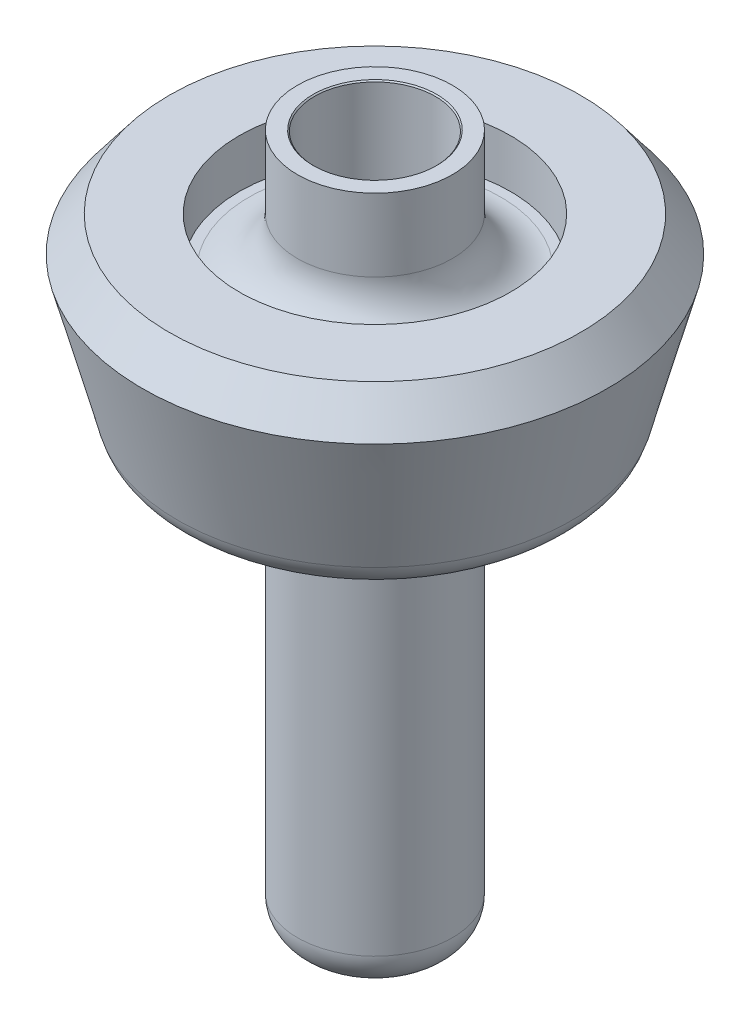
ISO-10303-21;
HEADER;
FILE_DESCRIPTION(('STEP AP214'),'2;1');
FILE_NAME('part.step','',(''),(''),'','','');
FILE_SCHEMA(('AUTOMOTIVE_DESIGN { 1 0 10303 214 1 1 1 1 }'));
ENDSEC;
DATA;
#1=APPLICATION_CONTEXT('core data for automotive mechanical design processes');
#2=APPLICATION_PROTOCOL_DEFINITION('international standard','automotive_design',2000,#1);
#3=PRODUCT_CONTEXT('',#1,'mechanical');
#4=PRODUCT('Part','Part','',(#3));
#5=PRODUCT_RELATED_PRODUCT_CATEGORY('part','',(#4));
#6=PRODUCT_DEFINITION_FORMATION('','',#4);
#7=PRODUCT_DEFINITION_CONTEXT('part definition',#1,'design');
#8=PRODUCT_DEFINITION('design','',#6,#7);
#9=PRODUCT_DEFINITION_SHAPE('','',#8);
#10=(LENGTH_UNIT() NAMED_UNIT(*) SI_UNIT(.MILLI.,.METRE.));
#11=(NAMED_UNIT(*) PLANE_ANGLE_UNIT() SI_UNIT($,.RADIAN.));
#12=(NAMED_UNIT(*) SI_UNIT($,.STERADIAN.) SOLID_ANGLE_UNIT());
#13=UNCERTAINTY_MEASURE_WITH_UNIT(LENGTH_MEASURE(1.E-05),#10,'distance_accuracy_value','');
#14=(GEOMETRIC_REPRESENTATION_CONTEXT(3) GLOBAL_UNCERTAINTY_ASSIGNED_CONTEXT((#13)) GLOBAL_UNIT_ASSIGNED_CONTEXT((#10,
#11,#12)) REPRESENTATION_CONTEXT('',''));
#15=CARTESIAN_POINT('',(0.,0.,0.));
#16=DIRECTION('',(0.,0.,1.));
#17=DIRECTION('',(1.,0.,0.));
#18=AXIS2_PLACEMENT_3D('',#15,#16,#17);
#19=CARTESIAN_POINT('',(1.6,15.,0.));
#20=DIRECTION('',(0.,-1.,0.));
#21=DIRECTION('',(1.,0.,0.));
#22=AXIS2_PLACEMENT_3D('',#19,#20,#21);
#23=PLANE('',#22);
#24=CARTESIAN_POINT('',(0.,15.,0.));
#25=DIRECTION('',(0.,1.,0.));
#26=DIRECTION('',(0.,0.,1.));
#27=AXIS2_PLACEMENT_3D('',#24,#25,#26);
#28=CIRCLE('',#27,1.275);
#29=CARTESIAN_POINT('',(0.,15.,1.275));
#30=VERTEX_POINT('',#29);
#31=EDGE_CURVE('E67',#30,#30,#28,.T.);
#32=ORIENTED_EDGE('',*,*,#31,.F.);
#33=EDGE_LOOP('',(#32));
#34=FACE_BOUND('',#33,.T.);
#35=CARTESIAN_POINT('',(0.,15.,0.));
#36=DIRECTION('',(0.,1.,0.));
#37=DIRECTION('',(-1.,0.,0.));
#38=AXIS2_PLACEMENT_3D('',#35,#36,#37);
#39=CIRCLE('',#38,1.6);
#40=CARTESIAN_POINT('',(-1.6,15.,0.));
#41=VERTEX_POINT('',#40);
#42=EDGE_CURVE('E60',#41,#41,#39,.T.);
#43=ORIENTED_EDGE('',*,*,#42,.T.);
#44=EDGE_LOOP('',(#43));
#45=FACE_BOUND('',#44,.T.);
#46=ADVANCED_FACE('F41',(#34,#45),#23,.F.);
#47=CARTESIAN_POINT('',(0.,0.597128129211026,0.));
#48=DIRECTION('',(0.,1.,0.));
#49=DIRECTION('',(-1.,0.,0.));
#50=AXIS2_PLACEMENT_3D('',#47,#48,#49);
#51=SPHERICAL_SURFACE('',#50,0.517128129211026);
#52=CARTESIAN_POINT('',(0.,0.149282032302755,0.));
#53=DIRECTION('',(0.,1.,0.));
#54=DIRECTION('',(-1.,0.,0.));
#55=AXIS2_PLACEMENT_3D('',#52,#53,#54);
#56=CIRCLE('',#55,0.258564064605514);
#57=CARTESIAN_POINT('',(-0.258564064605514,0.149282032302755,0.));
#58=VERTEX_POINT('',#57);
#59=EDGE_CURVE('E100',#58,#58,#56,.T.);
#60=ORIENTED_EDGE('',*,*,#59,.F.);
#61=EDGE_LOOP('',(#60));
#62=FACE_BOUND('',#61,.T.);
#63=ADVANCED_FACE('F117',(#62),#51,.T.);
#64=CARTESIAN_POINT('',(0.,0.149282032302755,0.));
#65=DIRECTION('',(0.,1.,0.));
#66=DIRECTION('',(-1.,0.,0.));
#67=AXIS2_PLACEMENT_3D('',#64,#65,#66);
#68=CONICAL_SURFACE('',#67,0.258564064605514,1.0471975511966);
#69=CARTESIAN_POINT('',(0.,0.707254079757288,0.));
#70=DIRECTION('',(0.,1.,0.));
#71=DIRECTION('',(-1.,0.,0.));
#72=AXIS2_PLACEMENT_3D('',#69,#70,#71);
#73=CIRCLE('',#72,1.225);
#74=CARTESIAN_POINT('',(-1.225,0.707254079757288,0.));
#75=VERTEX_POINT('',#74);
#76=EDGE_CURVE('E97',#75,#75,#73,.T.);
#77=CARTESIAN_POINT('',(-1.225,0.707254079757288,0.));
#78=CARTESIAN_POINT('',(-1.21493295900631,0.701441870929637,0.));
#79=CARTESIAN_POINT('',(-1.20486591801262,0.695629662101986,0.));
#80=CARTESIAN_POINT('',(-1.18473183602523,0.684005244446683,0.));
#81=CARTESIAN_POINT('',(-1.17466479503154,0.678193035619031,0.));
#82=CARTESIAN_POINT('',(-1.15453071304415,0.666568617963729,0.));
#83=CARTESIAN_POINT('',(-1.14446367205046,0.660756409136077,0.));
#84=CARTESIAN_POINT('',(-1.12432959006307,0.649131991480775,0.));
#85=CARTESIAN_POINT('',(-1.11426254906938,0.643319782653123,0.));
#86=CARTESIAN_POINT('',(-1.094128467082,0.63169536499782,0.));
#87=CARTESIAN_POINT('',(-1.0840614260883,0.625883156170169,0.));
#88=CARTESIAN_POINT('',(-1.06392734410092,0.614258738514866,0.));
#89=CARTESIAN_POINT('',(-1.05386030310723,0.608446529687215,0.));
#90=CARTESIAN_POINT('',(-1.03372622111984,0.596822112031912,0.));
#91=CARTESIAN_POINT('',(-1.02365918012615,0.591009903204261,0.));
#92=CARTESIAN_POINT('',(-1.00352509813876,0.579385485548958,0.));
#93=CARTESIAN_POINT('',(-0.993458057145071,0.573573276721306,0.));
#94=CARTESIAN_POINT('',(-0.973323975157686,0.561948859066004,0.));
#95=CARTESIAN_POINT('',(-0.963256934163994,0.556136650238352,0.));
#96=CARTESIAN_POINT('',(-0.943122852176609,0.544512232583049,0.));
#97=CARTESIAN_POINT('',(-0.933055811182916,0.538700023755398,0.));
#98=CARTESIAN_POINT('',(-0.912921729195531,0.527075606100095,0.));
#99=CARTESIAN_POINT('',(-0.902854688201838,0.521263397272444,0.));
#100=CARTESIAN_POINT('',(-0.882720606214453,0.509638979617141,0.));
#101=CARTESIAN_POINT('',(-0.872653565220761,0.50382677078949,0.));
#102=CARTESIAN_POINT('',(-0.852519483233375,0.492202353134187,0.));
#103=CARTESIAN_POINT('',(-0.842452442239683,0.486390144306536,0.));
#104=CARTESIAN_POINT('',(-0.822318360252298,0.474765726651233,0.));
#105=CARTESIAN_POINT('',(-0.812251319258605,0.468953517823581,0.));
#106=CARTESIAN_POINT('',(-0.79211723727122,0.457329100168279,0.));
#107=CARTESIAN_POINT('',(-0.782050196277527,0.451516891340627,0.));
#108=CARTESIAN_POINT('',(-0.761916114290142,0.439892473685324,0.));
#109=CARTESIAN_POINT('',(-0.75184907329645,0.434080264857673,0.));
#110=CARTESIAN_POINT('',(-0.731714991309064,0.42245584720237,0.));
#111=CARTESIAN_POINT('',(-0.721647950315372,0.416643638374719,0.));
#112=CARTESIAN_POINT('',(-0.701513868327987,0.405019220719416,0.));
#113=CARTESIAN_POINT('',(-0.691446827334294,0.399207011891765,0.));
#114=CARTESIAN_POINT('',(-0.671312745346909,0.387582594236462,0.));
#115=CARTESIAN_POINT('',(-0.661245704353217,0.381770385408811,0.));
#116=CARTESIAN_POINT('',(-0.641111622365832,0.370145967753508,0.));
#117=CARTESIAN_POINT('',(-0.631044581372139,0.364333758925856,0.));
#118=CARTESIAN_POINT('',(-0.610910499384754,0.352709341270554,0.));
#119=CARTESIAN_POINT('',(-0.600843458391061,0.346897132442902,0.));
#120=CARTESIAN_POINT('',(-0.580709376403676,0.335272714787599,0.));
#121=CARTESIAN_POINT('',(-0.570642335409984,0.329460505959948,0.));
#122=CARTESIAN_POINT('',(-0.550508253422598,0.317836088304645,0.));
#123=CARTESIAN_POINT('',(-0.540441212428906,0.312023879476994,0.));
#124=CARTESIAN_POINT('',(-0.520307130441521,0.300399461821691,0.));
#125=CARTESIAN_POINT('',(-0.510240089447828,0.29458725299404,0.));
#126=CARTESIAN_POINT('',(-0.490106007460443,0.282962835338737,0.));
#127=CARTESIAN_POINT('',(-0.48003896646675,0.277150626511085,0.));
#128=CARTESIAN_POINT('',(-0.459904884479365,0.265526208855783,0.));
#129=CARTESIAN_POINT('',(-0.449837843485673,0.259714000028131,0.));
#130=CARTESIAN_POINT('',(-0.429703761498288,0.248089582372828,0.));
#131=CARTESIAN_POINT('',(-0.419636720504595,0.242277373545177,0.));
#132=CARTESIAN_POINT('',(-0.39950263851721,0.230652955889874,0.));
#133=CARTESIAN_POINT('',(-0.389435597523517,0.224840747062223,0.));
#134=CARTESIAN_POINT('',(-0.369301515536132,0.21321632940692,0.));
#135=CARTESIAN_POINT('',(-0.35923447454244,0.207404120579269,0.));
#136=CARTESIAN_POINT('',(-0.339100392555055,0.195779702923966,0.));
#137=CARTESIAN_POINT('',(-0.329033351561362,0.189967494096315,0.));
#138=CARTESIAN_POINT('',(-0.308899269573977,0.178343076441012,0.));
#139=CARTESIAN_POINT('',(-0.298832228580284,0.17253086761336,0.));
#140=CARTESIAN_POINT('',(-0.278698146592899,0.160906449958058,0.));
#141=CARTESIAN_POINT('',(-0.268631105599207,0.155094241130406,0.));
#142=CARTESIAN_POINT('',(-0.258564064605514,0.149282032302755,0.));
#143=B_SPLINE_CURVE_WITH_KNOTS('',3,(#77,#78,#79,#80,#81,#82,#83,#84,#85,#86,#87,#88,#89,#90,
#91,#92,#93,#94,#95,#96,#97,#98,#99,#100,#101,#102,#103,#104,#105,#106,#107,#108,#109,#110,#111,
#112,#113,#114,#115,#116,#117,#118,#119,#120,#121,#122,#123,#124,#125,#126,#127,#128,#129,#130,
#131,#132,#133,#134,#135,#136,#137,#138,#139,#140,#141,#142),.UNSPECIFIED.,.F.,.F.,(4,2,2,2,2,2,
2,2,2,2,2,2,2,2,2,2,2,2,2,2,2,2,2,2,2,2,2,2,2,2,2,2,4),(0.,0.0348732529659086,
0.0697465059318169,0.104619758897725,0.139493011863634,0.174366264829542,0.20923951779545,
0.244112770761359,0.278986023727267,0.313859276693176,0.348732529659084,0.383605782624992,
0.418479035590901,0.453352288556809,0.488225541522718,0.523098794488626,0.557972047454534,
0.592845300420443,0.627718553386351,0.662591806352259,0.697465059318168,0.732338312284076,
0.767211565249984,0.802084818215893,0.836958071181801,0.87183132414771,0.906704577113618,
0.941577830079526,0.976451083045435,1.01132433601134,1.04619758897725,1.08107084194316,
1.11594409490907),.UNSPECIFIED.);
#144=EDGE_CURVE('BSEAM122',#75,#58,#143,.T.);
#145=ORIENTED_EDGE('',*,*,#76,.F.);
#146=ORIENTED_EDGE('',*,*,#59,.T.);
#147=ORIENTED_EDGE('',*,*,#144,.T.);
#148=ORIENTED_EDGE('',*,*,#144,.F.);
#149=EDGE_LOOP('',(#145,#147,#146,#148));
#150=FACE_BOUND('',#149,.T.);
#151=ADVANCED_FACE('F122',(#150),#68,.T.);
#152=CARTESIAN_POINT('',(0.,1.35677313259562,0.));
#153=DIRECTION('',(0.,1.,0.));
#154=DIRECTION('',(-1.,0.,0.));
#155=AXIS2_PLACEMENT_3D('',#152,#153,#154);
#156=TOROIDAL_SURFACE('',#155,0.850000000000002,0.750000000000001);
#157=CARTESIAN_POINT('',(0.,1.35677313259562,0.));
#158=DIRECTION('',(0.,1.,0.));
#159=DIRECTION('',(-1.,0.,0.));
#160=AXIS2_PLACEMENT_3D('',#157,#158,#159);
#161=CIRCLE('',#160,1.6);
#162=CARTESIAN_POINT('',(-1.6,1.35677313259562,0.));
#163=VERTEX_POINT('',#162);
#164=EDGE_CURVE('E94',#163,#163,#161,.T.);
#165=ORIENTED_EDGE('',*,*,#164,.F.);
#166=EDGE_LOOP('',(#165));
#167=FACE_BOUND('',#166,.T.);
#168=ORIENTED_EDGE('',*,*,#76,.T.);
#169=EDGE_LOOP('',(#168));
#170=FACE_BOUND('',#169,.T.);
#171=ADVANCED_FACE('F130',(#167,#170),#156,.T.);
#172=CARTESIAN_POINT('',(0.,17.7985554868669,0.));
#173=DIRECTION('',(0.,1.,0.));
#174=DIRECTION('',(-1.,0.,0.));
#175=AXIS2_PLACEMENT_3D('',#172,#173,#174);
#176=CYLINDRICAL_SURFACE('',#175,1.6);
#177=CARTESIAN_POINT('',(0.,8.74999999999999,0.));
#178=DIRECTION('',(0.,1.,0.));
#179=DIRECTION('',(-1.,0.,0.));
#180=AXIS2_PLACEMENT_3D('',#177,#178,#179);
#181=CIRCLE('',#180,1.6);
#182=CARTESIAN_POINT('',(-1.6,8.74999999999999,0.));
#183=VERTEX_POINT('',#182);
#184=EDGE_CURVE('E91',#183,#183,#181,.T.);
#185=ORIENTED_EDGE('',*,*,#184,.F.);
#186=EDGE_LOOP('',(#185));
#187=FACE_BOUND('',#186,.T.);
#188=ORIENTED_EDGE('',*,*,#164,.T.);
#189=EDGE_LOOP('',(#188));
#190=FACE_BOUND('',#189,.T.);
#191=ADVANCED_FACE('F134',(#187,#190),#176,.T.);
#192=CARTESIAN_POINT('',(0.,8.75,0.));
#193=DIRECTION('',(0.,1.,0.));
#194=DIRECTION('',(-1.,0.,0.));
#195=AXIS2_PLACEMENT_3D('',#192,#193,#194);
#196=TOROIDAL_SURFACE('',#195,2.35,0.75);
#197=CARTESIAN_POINT('',(0.,9.5,0.));
#198=DIRECTION('',(0.,1.,0.));
#199=DIRECTION('',(-1.,0.,0.));
#200=AXIS2_PLACEMENT_3D('',#197,#198,#199);
#201=CIRCLE('',#200,2.35000000000001);
#202=CARTESIAN_POINT('',(-2.35000000000001,9.5,0.));
#203=VERTEX_POINT('',#202);
#204=EDGE_CURVE('E88',#203,#203,#201,.T.);
#205=ORIENTED_EDGE('',*,*,#204,.F.);
#206=EDGE_LOOP('',(#205));
#207=FACE_BOUND('',#206,.T.);
#208=ORIENTED_EDGE('',*,*,#184,.T.);
#209=EDGE_LOOP('',(#208));
#210=FACE_BOUND('',#209,.T.);
#211=ADVANCED_FACE('F138',(#207,#210),#196,.F.);
#212=CARTESIAN_POINT('',(3.34682227311819,9.5,0.));
#213=DIRECTION('',(0.,1.,0.));
#214=DIRECTION('',(-1.,0.,0.));
#215=AXIS2_PLACEMENT_3D('',#212,#213,#214);
#216=PLANE('',#215);
#217=CARTESIAN_POINT('',(0.,9.5,0.));
#218=DIRECTION('',(0.,1.,0.));
#219=DIRECTION('',(-1.,0.,0.));
#220=AXIS2_PLACEMENT_3D('',#217,#218,#219);
#221=CIRCLE('',#220,3.34682227311819);
#222=CARTESIAN_POINT('',(-3.34682227311819,9.5,0.));
#223=VERTEX_POINT('',#222);
#224=EDGE_CURVE('E85',#223,#223,#221,.T.);
#225=ORIENTED_EDGE('',*,*,#224,.F.);
#226=EDGE_LOOP('',(#225));
#227=FACE_BOUND('',#226,.T.);
#228=ORIENTED_EDGE('',*,*,#204,.T.);
#229=EDGE_LOOP('',(#228));
#230=FACE_BOUND('',#229,.T.);
#231=ADVANCED_FACE('F142',(#227,#230),#216,.F.);
#232=CARTESIAN_POINT('',(0.,10.25,0.));
#233=DIRECTION('',(0.,1.,0.));
#234=DIRECTION('',(-1.,0.,0.));
#235=AXIS2_PLACEMENT_3D('',#232,#233,#234);
#236=TOROIDAL_SURFACE('',#235,3.34682227311819,0.750000000000001);
#237=CARTESIAN_POINT('',(0.,10.0558857161731,0.));
#238=DIRECTION('',(0.,1.,0.));
#239=DIRECTION('',(-1.,0.,0.));
#240=AXIS2_PLACEMENT_3D('',#237,#238,#239);
#241=CIRCLE('',#240,4.07126664283499);
#242=CARTESIAN_POINT('',(-4.07126664283499,10.0558857161731,0.));
#243=VERTEX_POINT('',#242);
#244=EDGE_CURVE('E82',#243,#243,#241,.T.);
#245=ORIENTED_EDGE('',*,*,#244,.F.);
#246=EDGE_LOOP('',(#245));
#247=FACE_BOUND('',#246,.T.);
#248=ORIENTED_EDGE('',*,*,#224,.T.);
#249=EDGE_LOOP('',(#248));
#250=FACE_BOUND('',#249,.T.);
#251=ADVANCED_FACE('F146',(#247,#250),#236,.T.);
#252=CARTESIAN_POINT('',(0.,10.0558857161731,0.));
#253=DIRECTION('',(0.,1.,0.));
#254=DIRECTION('',(-1.,0.,0.));
#255=AXIS2_PLACEMENT_3D('',#252,#253,#254);
#256=CONICAL_SURFACE('',#255,4.07126664283499,0.261799387799145);
#257=CARTESIAN_POINT('',(0.,12.7755556302832,0.));
#258=DIRECTION('',(0.,1.,0.));
#259=DIRECTION('',(-1.,0.,0.));
#260=AXIS2_PLACEMENT_3D('',#257,#258,#259);
#261=CIRCLE('',#260,4.8);
#262=CARTESIAN_POINT('',(-4.8,12.7755556302832,0.));
#263=VERTEX_POINT('',#262);
#264=EDGE_CURVE('E79',#263,#263,#261,.T.);
#265=ORIENTED_EDGE('',*,*,#264,.F.);
#266=EDGE_LOOP('',(#265));
#267=FACE_BOUND('',#266,.T.);
#268=ORIENTED_EDGE('',*,*,#244,.T.);
#269=EDGE_LOOP('',(#268));
#270=FACE_BOUND('',#269,.T.);
#271=ADVANCED_FACE('F150',(#267,#270),#256,.T.);
#272=CARTESIAN_POINT('',(0.,12.7755556302832,0.));
#273=DIRECTION('',(0.,-1.,0.));
#274=DIRECTION('',(1.,0.,0.));
#275=AXIS2_PLACEMENT_3D('',#272,#273,#274);
#276=CONICAL_SURFACE('',#275,4.8,0.654498469497876);
#277=CARTESIAN_POINT('',(0.,13.5,0.));
#278=DIRECTION('',(0.,1.,0.));
#279=DIRECTION('',(-1.,0.,0.));
#280=AXIS2_PLACEMENT_3D('',#277,#278,#279);
#281=CIRCLE('',#280,4.24411428382689);
#282=CARTESIAN_POINT('',(-4.24411428382689,13.5,0.));
#283=VERTEX_POINT('',#282);
#284=EDGE_CURVE('E76',#283,#283,#281,.T.);
#285=ORIENTED_EDGE('',*,*,#284,.F.);
#286=EDGE_LOOP('',(#285));
#287=FACE_BOUND('',#286,.T.);
#288=ORIENTED_EDGE('',*,*,#264,.T.);
#289=EDGE_LOOP('',(#288));
#290=FACE_BOUND('',#289,.T.);
#291=ADVANCED_FACE('F154',(#287,#290),#276,.T.);
#292=CARTESIAN_POINT('',(2.8,13.5,0.));
#293=DIRECTION('',(0.,-1.,0.));
#294=DIRECTION('',(1.,0.,0.));
#295=AXIS2_PLACEMENT_3D('',#292,#293,#294);
#296=PLANE('',#295);
#297=CARTESIAN_POINT('',(0.,13.5,0.));
#298=DIRECTION('',(0.,1.,0.));
#299=DIRECTION('',(-1.,0.,0.));
#300=AXIS2_PLACEMENT_3D('',#297,#298,#299);
#301=CIRCLE('',#300,2.8);
#302=CARTESIAN_POINT('',(-2.8,13.5,0.));
#303=VERTEX_POINT('',#302);
#304=EDGE_CURVE('E73',#303,#303,#301,.T.);
#305=ORIENTED_EDGE('',*,*,#304,.F.);
#306=EDGE_LOOP('',(#305));
#307=FACE_BOUND('',#306,.T.);
#308=ORIENTED_EDGE('',*,*,#284,.T.);
#309=EDGE_LOOP('',(#308));
#310=FACE_BOUND('',#309,.T.);
#311=ADVANCED_FACE('F158',(#307,#310),#296,.F.);
#312=CARTESIAN_POINT('',(0.,17.7985554868669,0.));
#313=DIRECTION('',(0.,1.,0.));
#314=DIRECTION('',(-1.,0.,0.));
#315=AXIS2_PLACEMENT_3D('',#312,#313,#314);
#316=CYLINDRICAL_SURFACE('',#315,2.8);
#317=CARTESIAN_POINT('',(0.,12.5,0.));
#318=DIRECTION('',(0.,1.,0.));
#319=DIRECTION('',(-1.,0.,0.));
#320=AXIS2_PLACEMENT_3D('',#317,#318,#319);
#321=CIRCLE('',#320,2.8);
#322=CARTESIAN_POINT('',(-2.8,12.5,0.));
#323=VERTEX_POINT('',#322);
#324=EDGE_CURVE('E64',#323,#323,#321,.T.);
#325=ORIENTED_EDGE('',*,*,#324,.F.);
#326=EDGE_LOOP('',(#325));
#327=FACE_BOUND('',#326,.T.);
#328=ORIENTED_EDGE('',*,*,#304,.T.);
#329=EDGE_LOOP('',(#328));
#330=FACE_BOUND('',#329,.T.);
#331=ADVANCED_FACE('F162',(#327,#330),#316,.F.);
#332=CARTESIAN_POINT('',(1.6,12.5,0.));
#333=DIRECTION('',(0.,-1.,0.));
#334=DIRECTION('',(1.,0.,0.));
#335=AXIS2_PLACEMENT_3D('',#332,#333,#334);
#336=PLANE('',#335);
#337=CARTESIAN_POINT('',(0.,12.5,0.));
#338=DIRECTION('',(0.,-1.,0.));
#339=DIRECTION('',(1.,0.,0.));
#340=AXIS2_PLACEMENT_3D('',#337,#338,#339);
#341=CIRCLE('',#340,2.6);
#342=CARTESIAN_POINT('',(2.6,12.5,0.));
#343=VERTEX_POINT('',#342);
#344=EDGE_CURVE('E11',#343,#343,#341,.T.);
#345=ORIENTED_EDGE('',*,*,#344,.T.);
#346=EDGE_LOOP('',(#345));
#347=FACE_BOUND('',#346,.T.);
#348=ORIENTED_EDGE('',*,*,#324,.T.);
#349=EDGE_LOOP('',(#348));
#350=FACE_BOUND('',#349,.T.);
#351=ADVANCED_FACE('F114',(#347,#350),#336,.F.);
#352=CARTESIAN_POINT('',(0.,17.7985554868669,0.));
#353=DIRECTION('',(0.,1.,0.));
#354=DIRECTION('',(-1.,0.,0.));
#355=AXIS2_PLACEMENT_3D('',#352,#353,#354);
#356=CYLINDRICAL_SURFACE('',#355,1.6);
#357=CARTESIAN_POINT('',(0.,13.5,0.));
#358=DIRECTION('',(0.,-1.,0.));
#359=DIRECTION('',(1.,0.,0.));
#360=AXIS2_PLACEMENT_3D('',#357,#358,#359);
#361=CIRCLE('',#360,1.6);
#362=CARTESIAN_POINT('',(1.6,13.5,0.));
#363=VERTEX_POINT('',#362);
#364=EDGE_CURVE('E48',#363,#363,#361,.F.);
#365=ORIENTED_EDGE('',*,*,#364,.T.);
#366=EDGE_LOOP('',(#365));
#367=FACE_BOUND('',#366,.T.);
#368=ORIENTED_EDGE('',*,*,#42,.F.);
#369=EDGE_LOOP('',(#368));
#370=FACE_BOUND('',#369,.T.);
#371=ADVANCED_FACE('F105',(#367,#370),#356,.T.);
#372=CARTESIAN_POINT('',(0.,13.5,0.));
#373=DIRECTION('',(0.,-1.,0.));
#374=DIRECTION('',(1.,0.,0.));
#375=AXIS2_PLACEMENT_3D('',#372,#373,#374);
#376=TOROIDAL_SURFACE('',#375,2.6,1.);
#377=ORIENTED_EDGE('',*,*,#344,.F.);
#378=EDGE_LOOP('',(#377));
#379=FACE_BOUND('',#378,.T.);
#380=ORIENTED_EDGE('',*,*,#364,.F.);
#381=EDGE_LOOP('',(#380));
#382=FACE_BOUND('',#381,.T.);
#383=ADVANCED_FACE('F43',(#379,#382),#376,.F.);
#384=CARTESIAN_POINT('',(0.,9.5,0.));
#385=DIRECTION('',(0.,1.,0.));
#386=DIRECTION('',(0.,0.,1.));
#387=AXIS2_PLACEMENT_3D('',#384,#385,#386);
#388=CONICAL_SURFACE('',#387,1.25,1.02974425867665);
#389=CARTESIAN_POINT('',(0.,8.74892422621555,0.));
#390=VERTEX_POINT('',#389);
#391=VERTEX_LOOP('',#390);
#392=FACE_BOUND('',#391,.T.);
#393=CARTESIAN_POINT('',(0.,9.5,0.));
#394=DIRECTION('',(0.,1.,0.));
#395=DIRECTION('',(0.,0.,1.));
#396=AXIS2_PLACEMENT_3D('',#393,#394,#395);
#397=CIRCLE('',#396,1.25);
#398=CARTESIAN_POINT('',(0.,9.5,1.25));
#399=VERTEX_POINT('',#398);
#400=EDGE_CURVE('E58',#399,#399,#397,.T.);
#401=ORIENTED_EDGE('',*,*,#400,.T.);
#402=EDGE_LOOP('',(#401));
#403=FACE_BOUND('',#402,.T.);
#404=ADVANCED_FACE('F51',(#392,#403),#388,.F.);
#405=CARTESIAN_POINT('',(0.,15.,0.));
#406=DIRECTION('',(0.,1.,0.));
#407=DIRECTION('',(0.,0.,1.));
#408=AXIS2_PLACEMENT_3D('',#405,#406,#407);
#409=CYLINDRICAL_SURFACE('',#408,1.25);
#410=ORIENTED_EDGE('',*,*,#400,.F.);
#411=EDGE_LOOP('',(#410));
#412=FACE_BOUND('',#411,.T.);
#413=CARTESIAN_POINT('',(0.,14.975,0.));
#414=DIRECTION('',(0.,1.,0.));
#415=DIRECTION('',(0.,0.,1.));
#416=AXIS2_PLACEMENT_3D('',#413,#414,#415);
#417=CIRCLE('',#416,1.25);
#418=CARTESIAN_POINT('',(0.,14.975,1.25));
#419=VERTEX_POINT('',#418);
#420=EDGE_CURVE('E61',#419,#419,#417,.T.);
#421=ORIENTED_EDGE('',*,*,#420,.T.);
#422=EDGE_LOOP('',(#421));
#423=FACE_BOUND('',#422,.T.);
#424=ADVANCED_FACE('F54',(#412,#423),#409,.F.);
#425=CARTESIAN_POINT('',(0.,15.,0.));
#426=DIRECTION('',(0.,1.,0.));
#427=DIRECTION('',(0.,0.,1.));
#428=AXIS2_PLACEMENT_3D('',#425,#426,#427);
#429=CONICAL_SURFACE('',#428,1.275,0.785398163397479);
#430=ORIENTED_EDGE('',*,*,#420,.F.);
#431=EDGE_LOOP('',(#430));
#432=FACE_BOUND('',#431,.T.);
#433=ORIENTED_EDGE('',*,*,#31,.T.);
#434=EDGE_LOOP('',(#433));
#435=FACE_BOUND('',#434,.T.);
#436=ADVANCED_FACE('F172',(#432,#435),#429,.F.);
#437=CLOSED_SHELL('',(#46,#63,#151,#171,#191,#211,#231,#251,#271,#291,#311,#331,#351,#371,#383,
#404,#424,#436));
#438=MANIFOLD_SOLID_BREP('B2',#437);
#439=ADVANCED_BREP_SHAPE_REPRESENTATION('',(#18,#438),#14);
#440=SHAPE_DEFINITION_REPRESENTATION(#9,#439);
ENDSEC;
END-ISO-10303-21;
